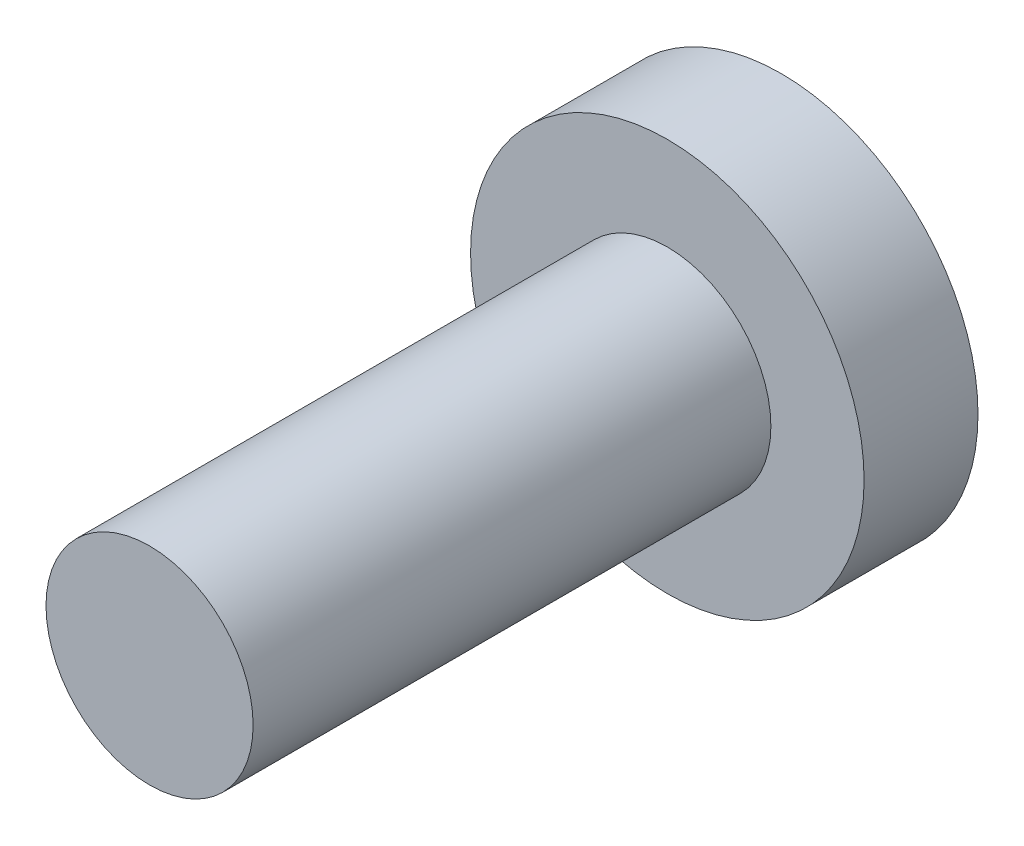
ISO-10303-21;
HEADER;
FILE_DESCRIPTION(('STEP AP214'),'2;1');
FILE_NAME('part.step','',(''),(''),'','','');
FILE_SCHEMA(('AUTOMOTIVE_DESIGN { 1 0 10303 214 1 1 1 1 }'));
ENDSEC;
DATA;
#1=APPLICATION_CONTEXT('core data for automotive mechanical design processes');
#2=APPLICATION_PROTOCOL_DEFINITION('international standard','automotive_design',2000,#1);
#3=PRODUCT_CONTEXT('',#1,'mechanical');
#4=PRODUCT('Part','Part','',(#3));
#5=PRODUCT_RELATED_PRODUCT_CATEGORY('part','',(#4));
#6=PRODUCT_DEFINITION_FORMATION('','',#4);
#7=PRODUCT_DEFINITION_CONTEXT('part definition',#1,'design');
#8=PRODUCT_DEFINITION('design','',#6,#7);
#9=PRODUCT_DEFINITION_SHAPE('','',#8);
#10=(LENGTH_UNIT() NAMED_UNIT(*) SI_UNIT(.MILLI.,.METRE.));
#11=(NAMED_UNIT(*) PLANE_ANGLE_UNIT() SI_UNIT($,.RADIAN.));
#12=(NAMED_UNIT(*) SI_UNIT($,.STERADIAN.) SOLID_ANGLE_UNIT());
#13=UNCERTAINTY_MEASURE_WITH_UNIT(LENGTH_MEASURE(1.E-05),#10,'distance_accuracy_value','');
#14=(GEOMETRIC_REPRESENTATION_CONTEXT(3) GLOBAL_UNCERTAINTY_ASSIGNED_CONTEXT((#13)) GLOBAL_UNIT_ASSIGNED_CONTEXT((#10,
#11,#12)) REPRESENTATION_CONTEXT('',''));
#15=CARTESIAN_POINT('',(0.,0.,0.));
#16=DIRECTION('',(0.,0.,1.));
#17=DIRECTION('',(1.,0.,0.));
#18=AXIS2_PLACEMENT_3D('',#15,#16,#17);
#19=CARTESIAN_POINT('',(0.,0.,2.2));
#20=DIRECTION('',(0.,0.,-1.));
#21=DIRECTION('',(-1.,0.,0.));
#22=AXIS2_PLACEMENT_3D('',#19,#20,#21);
#23=CYLINDRICAL_SURFACE('',#22,3.8);
#24=CARTESIAN_POINT('',(0.,0.,2.2));
#25=DIRECTION('',(0.,0.,1.));
#26=DIRECTION('',(1.,0.,0.));
#27=AXIS2_PLACEMENT_3D('',#24,#25,#26);
#28=CIRCLE('',#27,3.8);
#29=CARTESIAN_POINT('',(3.8,0.,2.2));
#30=VERTEX_POINT('',#29);
#31=EDGE_CURVE('E51',#30,#30,#28,.T.);
#32=ORIENTED_EDGE('',*,*,#31,.F.);
#33=EDGE_LOOP('',(#32));
#34=FACE_BOUND('',#33,.T.);
#35=CARTESIAN_POINT('',(0.,0.,0.));
#36=DIRECTION('',(0.,0.,1.));
#37=DIRECTION('',(1.,0.,0.));
#38=AXIS2_PLACEMENT_3D('',#35,#36,#37);
#39=CIRCLE('',#38,3.8);
#40=CARTESIAN_POINT('',(3.8,0.,0.));
#41=VERTEX_POINT('',#40);
#42=EDGE_CURVE('E46',#41,#41,#39,.T.);
#43=ORIENTED_EDGE('',*,*,#42,.T.);
#44=EDGE_LOOP('',(#43));
#45=FACE_BOUND('',#44,.T.);
#46=ADVANCED_FACE('F43',(#34,#45),#23,.T.);
#47=CARTESIAN_POINT('',(0.,0.,2.2));
#48=DIRECTION('',(0.,0.,1.));
#49=DIRECTION('',(1.,0.,0.));
#50=AXIS2_PLACEMENT_3D('',#47,#48,#49);
#51=PLANE('',#50);
#52=CARTESIAN_POINT('',(0.,0.,2.2));
#53=DIRECTION('',(0.,0.,1.));
#54=DIRECTION('',(1.,0.,0.));
#55=AXIS2_PLACEMENT_3D('',#52,#53,#54);
#56=CIRCLE('',#55,2.);
#57=CARTESIAN_POINT('',(2.,0.,2.2));
#58=VERTEX_POINT('',#57);
#59=EDGE_CURVE('E10',#58,#58,#56,.T.);
#60=ORIENTED_EDGE('',*,*,#59,.F.);
#61=EDGE_LOOP('',(#60));
#62=FACE_BOUND('',#61,.T.);
#63=ORIENTED_EDGE('',*,*,#31,.T.);
#64=EDGE_LOOP('',(#63));
#65=FACE_BOUND('',#64,.T.);
#66=ADVANCED_FACE('F71',(#62,#65),#51,.T.);
#67=CARTESIAN_POINT('',(0.,0.,0.));
#68=DIRECTION('',(0.,0.,1.));
#69=DIRECTION('',(1.,0.,0.));
#70=AXIS2_PLACEMENT_3D('',#67,#68,#69);
#71=PLANE('',#70);
#72=ORIENTED_EDGE('',*,*,#42,.F.);
#73=EDGE_LOOP('',(#72));
#74=FACE_BOUND('',#73,.T.);
#75=ADVANCED_FACE('F68',(#74),#71,.F.);
#76=CARTESIAN_POINT('',(0.,0.,12.2));
#77=DIRECTION('',(0.,0.,-1.));
#78=DIRECTION('',(-1.,0.,0.));
#79=AXIS2_PLACEMENT_3D('',#76,#77,#78);
#80=CYLINDRICAL_SURFACE('',#79,2.);
#81=CARTESIAN_POINT('',(0.,0.,12.2));
#82=DIRECTION('',(0.,0.,1.));
#83=DIRECTION('',(1.,0.,0.));
#84=AXIS2_PLACEMENT_3D('',#81,#82,#83);
#85=CIRCLE('',#84,2.);
#86=CARTESIAN_POINT('',(2.,0.,12.2));
#87=VERTEX_POINT('',#86);
#88=EDGE_CURVE('E58',#87,#87,#85,.T.);
#89=ORIENTED_EDGE('',*,*,#88,.F.);
#90=EDGE_LOOP('',(#89));
#91=FACE_BOUND('',#90,.T.);
#92=ORIENTED_EDGE('',*,*,#59,.T.);
#93=EDGE_LOOP('',(#92));
#94=FACE_BOUND('',#93,.T.);
#95=ADVANCED_FACE('F70',(#91,#94),#80,.T.);
#96=CARTESIAN_POINT('',(0.,0.,12.2));
#97=DIRECTION('',(0.,0.,1.));
#98=DIRECTION('',(1.,0.,0.));
#99=AXIS2_PLACEMENT_3D('',#96,#97,#98);
#100=PLANE('',#99);
#101=ORIENTED_EDGE('',*,*,#88,.T.);
#102=EDGE_LOOP('',(#101));
#103=FACE_BOUND('',#102,.T.);
#104=ADVANCED_FACE('F76',(#103),#100,.T.);
#105=CLOSED_SHELL('',(#46,#66,#75,#95,#104));
#106=MANIFOLD_SOLID_BREP('B2',#105);
#107=ADVANCED_BREP_SHAPE_REPRESENTATION('',(#18,#106),#14);
#108=SHAPE_DEFINITION_REPRESENTATION(#9,#107);
ENDSEC;
END-ISO-10303-21;
